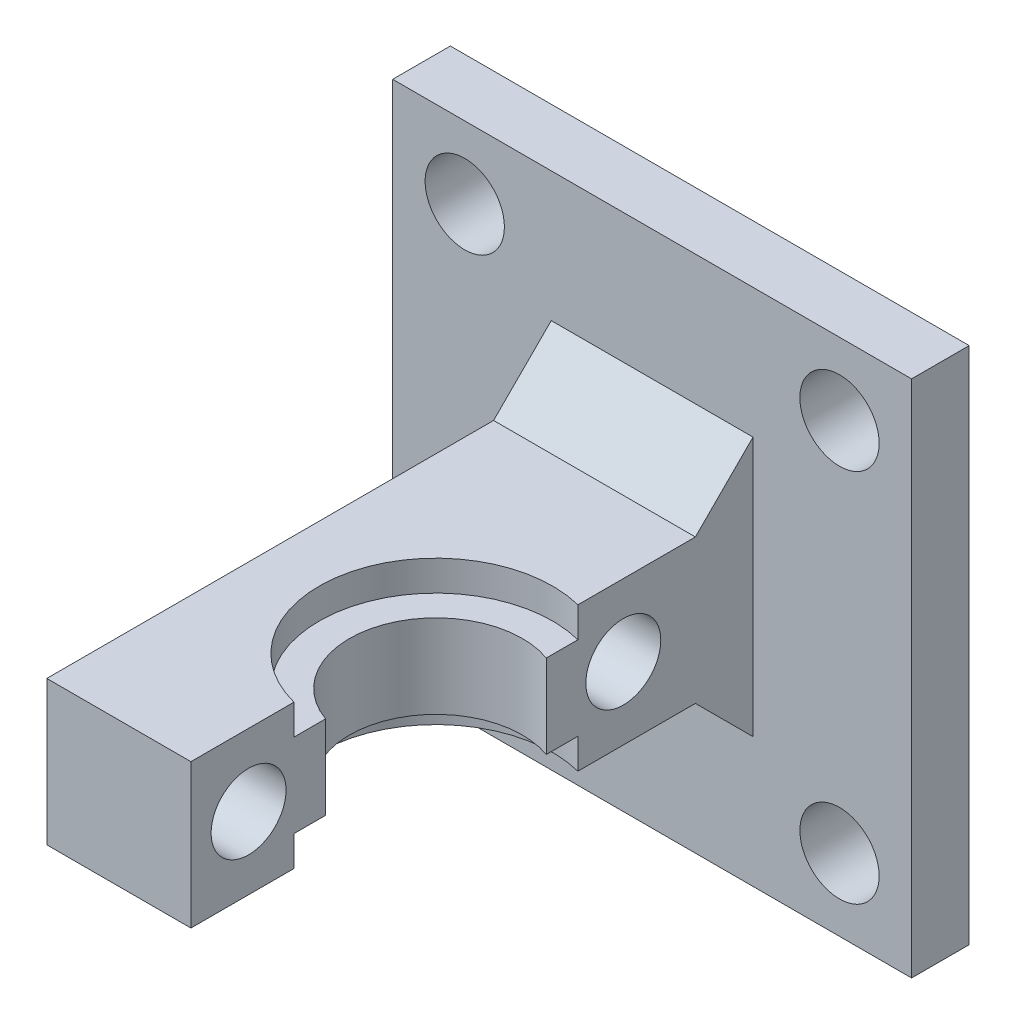
ISO-10303-21;
HEADER;
FILE_DESCRIPTION(('STEP AP214'),'2;1');
FILE_NAME('part.step','',(''),(''),'','','');
FILE_SCHEMA(('AUTOMOTIVE_DESIGN { 1 0 10303 214 1 1 1 1 }'));
ENDSEC;
DATA;
#1=APPLICATION_CONTEXT('core data for automotive mechanical design processes');
#2=APPLICATION_PROTOCOL_DEFINITION('international standard','automotive_design',2000,#1);
#3=PRODUCT_CONTEXT('',#1,'mechanical');
#4=PRODUCT('Part','Part','',(#3));
#5=PRODUCT_RELATED_PRODUCT_CATEGORY('part','',(#4));
#6=PRODUCT_DEFINITION_FORMATION('','',#4);
#7=PRODUCT_DEFINITION_CONTEXT('part definition',#1,'design');
#8=PRODUCT_DEFINITION('design','',#6,#7);
#9=PRODUCT_DEFINITION_SHAPE('','',#8);
#10=(LENGTH_UNIT() NAMED_UNIT(*) SI_UNIT(.MILLI.,.METRE.));
#11=(NAMED_UNIT(*) PLANE_ANGLE_UNIT() SI_UNIT($,.RADIAN.));
#12=(NAMED_UNIT(*) SI_UNIT($,.STERADIAN.) SOLID_ANGLE_UNIT());
#13=UNCERTAINTY_MEASURE_WITH_UNIT(LENGTH_MEASURE(1.E-05),#10,'distance_accuracy_value','');
#14=(GEOMETRIC_REPRESENTATION_CONTEXT(3) GLOBAL_UNCERTAINTY_ASSIGNED_CONTEXT((#13)) GLOBAL_UNIT_ASSIGNED_CONTEXT((#10,
#11,#12)) REPRESENTATION_CONTEXT('',''));
#15=CARTESIAN_POINT('',(0.,0.,0.));
#16=DIRECTION('',(0.,0.,1.));
#17=DIRECTION('',(1.,0.,0.));
#18=AXIS2_PLACEMENT_3D('',#15,#16,#17);
#19=CARTESIAN_POINT('',(5.,5.,24.));
#20=DIRECTION('',(0.,-1.,0.));
#21=DIRECTION('',(0.,0.,-1.));
#22=AXIS2_PLACEMENT_3D('',#19,#20,#21);
#23=CYLINDRICAL_SURFACE('',#22,8.1);
#24=CARTESIAN_POINT('',(5.,-2.9,24.));
#25=DIRECTION('',(0.,1.,0.));
#26=DIRECTION('',(0.,0.,1.));
#27=AXIS2_PLACEMENT_3D('',#24,#25,#26);
#28=CIRCLE('',#27,8.1);
#29=CARTESIAN_POINT('',(3.,-2.9,31.8492037812762));
#30=VERTEX_POINT('',#29);
#31=CARTESIAN_POINT('',(7.,-2.9,16.1507962187238));
#32=VERTEX_POINT('',#31);
#33=EDGE_CURVE('E52',#30,#32,#28,.F.);
#34=ORIENTED_EDGE('',*,*,#33,.F.);
#35=DIRECTION('',(0.,-1.,0.));
#36=VECTOR('',#35,1.);
#37=CARTESIAN_POINT('',(3.,5.,31.8492037812762));
#38=LINE('',#37,#36);
#39=CARTESIAN_POINT('',(3.,-5.,31.8492037812762));
#40=VERTEX_POINT('',#39);
#41=EDGE_CURVE('E226',#30,#40,#38,.T.);
#42=ORIENTED_EDGE('',*,*,#41,.T.);
#43=CARTESIAN_POINT('',(5.,-5.,24.));
#44=DIRECTION('',(0.,-1.,0.));
#45=DIRECTION('',(0.,0.,1.));
#46=AXIS2_PLACEMENT_3D('',#43,#44,#45);
#47=CIRCLE('',#46,8.1);
#48=CARTESIAN_POINT('',(7.,-5.,16.1507962187238));
#49=VERTEX_POINT('',#48);
#50=EDGE_CURVE('E216',#40,#49,#47,.T.);
#51=ORIENTED_EDGE('',*,*,#50,.T.);
#52=DIRECTION('',(0.,-1.,0.));
#53=VECTOR('',#52,1.);
#54=CARTESIAN_POINT('',(7.,5.,16.1507962187238));
#55=LINE('',#54,#53);
#56=EDGE_CURVE('E222',#32,#49,#55,.T.);
#57=ORIENTED_EDGE('',*,*,#56,.F.);
#58=EDGE_LOOP('',(#34,#42,#51,#57));
#59=FACE_BOUND('',#58,.T.);
#60=ADVANCED_FACE('F33',(#59),#23,.F.);
#61=CARTESIAN_POINT('',(-7.,0.,13.));
#62=DIRECTION('',(1.,0.,0.));
#63=DIRECTION('',(0.,0.,-1.));
#64=AXIS2_PLACEMENT_3D('',#61,#62,#63);
#65=CYLINDRICAL_SURFACE('',#64,2.6);
#66=CARTESIAN_POINT('',(-7.,0.,13.));
#67=DIRECTION('',(1.,0.,0.));
#68=DIRECTION('',(0.,0.,-1.));
#69=AXIS2_PLACEMENT_3D('',#66,#67,#68);
#70=CIRCLE('',#69,2.6);
#71=CARTESIAN_POINT('',(-7.,0.,10.4));
#72=VERTEX_POINT('',#71);
#73=EDGE_CURVE('E190',#72,#72,#70,.T.);
#74=ORIENTED_EDGE('',*,*,#73,.F.);
#75=EDGE_LOOP('',(#74));
#76=FACE_BOUND('',#75,.T.);
#77=CARTESIAN_POINT('',(7.,0.,13.));
#78=DIRECTION('',(1.,0.,0.));
#79=DIRECTION('',(0.,0.,-1.));
#80=AXIS2_PLACEMENT_3D('',#77,#78,#79);
#81=CIRCLE('',#80,2.6);
#82=CARTESIAN_POINT('',(7.,0.,10.4));
#83=VERTEX_POINT('',#82);
#84=EDGE_CURVE('E194',#83,#83,#81,.T.);
#85=ORIENTED_EDGE('',*,*,#84,.T.);
#86=EDGE_LOOP('',(#85));
#87=FACE_BOUND('',#86,.T.);
#88=CARTESIAN_POINT('',(3.70000000000004,0.,15.6));
#89=CARTESIAN_POINT('',(3.70000266711035,0.0246446385520677,15.5999994858206));
#90=CARTESIAN_POINT('',(3.70228665332227,0.0493029766518838,15.5996451391014));
#91=CARTESIAN_POINT('',(3.7111974815542,0.0978061832979912,15.5982735696307));
#92=CARTESIAN_POINT('',(3.71782939200899,0.121650068254081,15.5972555732615));
#93=CARTESIAN_POINT('',(3.73478093359689,0.167721413711001,15.5946866605523));
#94=CARTESIAN_POINT('',(3.74507166867469,0.18995994235702,15.5931399235997));
#95=CARTESIAN_POINT('',(3.76865895936663,0.23272295071679,15.5896526800661));
#96=CARTESIAN_POINT('',(3.78195654391533,0.253246840386271,15.5877120387155));
#97=CARTESIAN_POINT('',(3.82032584808766,0.305253555135389,15.5822245452235));
#98=CARTESIAN_POINT('',(3.84743823797105,0.335204653877232,15.5784526270009));
#99=CARTESIAN_POINT('',(3.90594045527389,0.390554954343029,15.5706514688819));
#100=CARTESIAN_POINT('',(3.93734337494103,0.415939650404897,15.566621462258));
#101=CARTESIAN_POINT('',(4.02515134468757,0.478472467646816,15.555907024401));
#102=CARTESIAN_POINT('',(4.08412697352073,0.511997711192338,15.5492666925414));
#103=CARTESIAN_POINT('',(4.20635063739925,0.570056355504465,15.5369066139386));
#104=CARTESIAN_POINT('',(4.26960732409404,0.594570862394637,15.5311888154973));
#105=CARTESIAN_POINT('',(4.44149399094251,0.65004419576083,15.5176895771876));
#106=CARTESIAN_POINT('',(4.55233408181402,0.674454695045524,15.5110628594));
#107=CARTESIAN_POINT('',(4.7766314996914,0.706608431328433,15.5021860240456));
#108=CARTESIAN_POINT('',(4.89009537969944,0.714304017630115,15.4999484206722));
#109=CARTESIAN_POINT('',(5.12229324478594,0.71396883979046,15.5000554958552));
#110=CARTESIAN_POINT('',(5.24103209177177,0.705206499796562,15.5026133283509));
#111=CARTESIAN_POINT('',(5.41652582320383,0.6781764213266,15.5100087137989));
#112=CARTESIAN_POINT('',(5.47449062289461,0.66688321653117,15.5130586724157));
#113=CARTESIAN_POINT('',(5.58910378443032,0.639198328721435,15.5202455099649));
#114=CARTESIAN_POINT('',(5.64575334433879,0.622811498438386,15.5243813537871));
#115=CARTESIAN_POINT('',(5.74857198642842,0.587138068771593,15.5328937628555));
#116=CARTESIAN_POINT('',(5.79503164697384,0.568663334269773,15.5371396087686));
#117=CARTESIAN_POINT('',(5.88579619989819,0.526820491825865,15.5461580607854));
#118=CARTESIAN_POINT('',(5.93009690279299,0.503443302846257,15.5509316365575));
#119=CARTESIAN_POINT('',(6.01574848190205,0.450613010832115,15.5607977001414));
#120=CARTESIAN_POINT('',(6.05705358677998,0.421084955973537,15.5658935240709));
#121=CARTESIAN_POINT('',(6.13369806208265,0.355066674843864,15.5758560511966));
#122=CARTESIAN_POINT('',(6.16906584958734,0.318611502706494,15.580723760424));
#123=CARTESIAN_POINT('',(6.21524615531826,0.257468421027484,15.5873048949636));
#124=CARTESIAN_POINT('',(6.22968243270645,0.235566068968109,15.5894085906244));
#125=CARTESIAN_POINT('',(6.25510879554287,0.189787058994486,15.5931655494481));
#126=CARTESIAN_POINT('',(6.26610121078474,0.165911749676084,15.5948191170257));
#127=CARTESIAN_POINT('',(6.28388688228515,0.116301470061408,15.5975171316654));
#128=CARTESIAN_POINT('',(6.29063612343278,0.0905500027884597,15.5985551878422));
#129=CARTESIAN_POINT('',(6.29904058249715,0.0382106245730077,15.5998504050423));
#130=CARTESIAN_POINT('',(6.30070104639114,0.0116236035892148,15.6001083702512));
#131=CARTESIAN_POINT('',(6.29887056882852,-0.0380731569205889,15.5998253253242));
#132=CARTESIAN_POINT('',(6.29598820081816,-0.0612083206831745,15.5993786975264));
#133=CARTESIAN_POINT('',(6.28643813542854,-0.106660739262427,15.5979109788073));
#134=CARTESIAN_POINT('',(6.27976842690653,-0.12897755281286,15.5968895826769));
#135=CARTESIAN_POINT('',(6.26101576181098,-0.177859143658967,15.594052748741));
#136=CARTESIAN_POINT('',(6.24798432530818,-0.204049582857031,15.592101002369));
#137=CARTESIAN_POINT('',(6.21789815965699,-0.253949305314392,15.5876902125312));
#138=CARTESIAN_POINT('',(6.20083612848259,-0.277653971341187,15.5852302493814));
#139=CARTESIAN_POINT('',(6.15453441868819,-0.333627827481036,15.5787277714951));
#140=CARTESIAN_POINT('',(6.12344521303143,-0.364335233239077,15.5745042451843));
#141=CARTESIAN_POINT('',(6.05698337493439,-0.420630820405962,15.5659070513656));
#142=CARTESIAN_POINT('',(6.02160064247138,-0.446206540238347,15.5615330478818));
#143=CARTESIAN_POINT('',(5.92213134412991,-0.509411670240929,15.5499336673464));
#144=CARTESIAN_POINT('',(5.85537805042234,-0.542846011862888,15.5428694577233));
#145=CARTESIAN_POINT('',(5.71768049284909,-0.599658985099565,15.5300667977269));
#146=CARTESIAN_POINT('',(5.64672803788713,-0.623017173688397,15.5243310534235));
#147=CARTESIAN_POINT('',(5.51670520338476,-0.657572868652399,15.5155208162479));
#148=CARTESIAN_POINT('',(5.45804161556919,-0.670258406185354,15.5121448070635));
#149=CARTESIAN_POINT('',(5.33980979546832,-0.690741344057659,15.5065880688304));
#150=CARTESIAN_POINT('',(5.28024110858591,-0.698536198876264,15.5044079623038));
#151=CARTESIAN_POINT('',(5.10044123600596,-0.715137062163548,15.499750618356));
#152=CARTESIAN_POINT('',(4.97942801978185,-0.717081836711884,15.4991779653655));
#153=CARTESIAN_POINT('',(4.79698794200043,-0.706407605688524,15.5021950705903));
#154=CARTESIAN_POINT('',(4.73504050665241,-0.700375530704898,15.5039061798466));
#155=CARTESIAN_POINT('',(4.61190487087694,-0.683228763101747,15.5086419900749));
#156=CARTESIAN_POINT('',(4.55071625158819,-0.672117015574107,15.5116659298432));
#157=CARTESIAN_POINT('',(4.43005436525828,-0.644413257281783,15.5189153544298));
#158=CARTESIAN_POINT('',(4.37057283403123,-0.627855540388093,15.5231332978862));
#159=CARTESIAN_POINT('',(4.25385495532783,-0.588470701840785,15.5326110043088));
#160=CARTESIAN_POINT('',(4.19661472162409,-0.565655036050854,15.5378688587451));
#161=CARTESIAN_POINT('',(4.10589247018947,-0.522180572291755,15.5470810797948));
#162=CARTESIAN_POINT('',(4.07132543186498,-0.503742575664736,15.5508162531238));
#163=CARTESIAN_POINT('',(4.00423513743781,-0.463362068038479,15.5584604683142));
#164=CARTESIAN_POINT('',(3.97171401903171,-0.441415973623528,15.5623696849777));
#165=CARTESIAN_POINT('',(3.90939509969128,-0.393304192473495,15.5701971519027));
#166=CARTESIAN_POINT('',(3.87962686596363,-0.367099537587357,15.5741151201549));
#167=CARTESIAN_POINT('',(3.82473921050896,-0.310131578920839,15.5815960872351));
#168=CARTESIAN_POINT('',(3.79960800705441,-0.279380196204407,15.5851599747578));
#169=CARTESIAN_POINT('',(3.76413655062274,-0.225227087124255,15.5903127405192));
#170=CARTESIAN_POINT('',(3.75173702375318,-0.203202245365268,15.5921492339267));
#171=CARTESIAN_POINT('',(3.73051096100129,-0.157465050800809,15.5953279095812));
#172=CARTESIAN_POINT('',(3.72167775420576,-0.133755947113204,15.5966710142987));
#173=CARTESIAN_POINT('',(3.7100767482343,-0.0916532261959274,15.5984452222065));
#174=CARTESIAN_POINT('',(3.70631804463677,-0.0735368951870844,15.5990242474313));
#175=CARTESIAN_POINT('',(3.70127857406311,-0.036949628459925,15.5998018439192));
#176=CARTESIAN_POINT('',(3.69999800018826,-0.0184786652211387,15.6000003855341));
#177=CARTESIAN_POINT('',(3.70000000000004,0.,15.6));
#178=B_SPLINE_CURVE_WITH_KNOTS('',3,(#88,#89,#90,#91,#92,#93,#94,#95,#96,#97,#98,#99,#100,#101,
#102,#103,#104,#105,#106,#107,#108,#109,#110,#111,#112,#113,#114,#115,#116,#117,#118,#119,#120,
#121,#122,#123,#124,#125,#126,#127,#128,#129,#130,#131,#132,#133,#134,#135,#136,#137,#138,#139,
#140,#141,#142,#143,#144,#145,#146,#147,#148,#149,#150,#151,#152,#153,#154,#155,#156,#157,#158,
#159,#160,#161,#162,#163,#164,#165,#166,#167,#168,#169,#170,#171,#172,#173,#174,#175,#176,#177),
.UNSPECIFIED.,.T.,.F.,(4,2,2,2,2,2,2,2,2,2,2,2,2,2,2,2,2,2,2,2,2,2,2,2,2,2,2,2,2,2,2,2,2,2,2,2,
2,2,2,2,2,2,2,2,4),(0.,0.0738559209400195,0.147798090186888,0.221168809397196,0.294564673938246,
0.415591611305624,0.5369964639744,0.740334957731089,0.944097415419544,1.28330637190744,
1.62348107937878,1.97913570584439,2.15635512205151,2.33340621495194,2.48371439072381,
2.63430348804519,2.78684792182428,2.9386400391484,3.01734655899313,3.09599971784728,
3.17545585083391,3.25483004556811,3.32444001364924,3.39408698043023,3.48155640916668,
3.5691855338482,3.70014981419978,3.83142837309955,4.05515514549684,4.27933371570412,
4.45943339526073,4.63962673617629,5.00096902586841,5.1876029674382,5.37412883937237,
5.55950193294432,5.74453791981373,5.86243992775728,5.98046314780498,6.09963439825919,
6.2184985595714,6.2942727831185,6.36990460452187,6.42527780475544,6.48065531961597),.UNSPECIFIED.);
#179=CARTESIAN_POINT('',(3.70000000000004,0.,15.6));
#180=VERTEX_POINT('',#179);
#181=EDGE_CURVE('E11',#180,#180,#178,.T.);
#182=ORIENTED_EDGE('',*,*,#181,.F.);
#183=EDGE_LOOP('',(#182));
#184=FACE_BOUND('',#183,.T.);
#185=ADVANCED_FACE('F326',(#76,#87,#184),#65,.F.);
#186=CARTESIAN_POINT('',(18.,18.,4.));
#187=DIRECTION('',(-1.,0.,0.));
#188=DIRECTION('',(0.,-1.,0.));
#189=AXIS2_PLACEMENT_3D('',#186,#187,#188);
#190=PLANE('',#189);
#191=DIRECTION('',(0.,1.,0.));
#192=VECTOR('',#191,1.);
#193=CARTESIAN_POINT('',(18.,18.,0.));
#194=LINE('',#193,#192);
#195=CARTESIAN_POINT('',(18.,-18.,0.));
#196=VERTEX_POINT('',#195);
#197=CARTESIAN_POINT('',(18.,18.,0.));
#198=VERTEX_POINT('',#197);
#199=EDGE_CURVE('E260',#196,#198,#194,.T.);
#200=ORIENTED_EDGE('',*,*,#199,.T.);
#201=DIRECTION('',(0.,0.,-1.));
#202=VECTOR('',#201,1.);
#203=CARTESIAN_POINT('',(18.,18.,4.));
#204=LINE('',#203,#202);
#205=CARTESIAN_POINT('',(18.,18.,4.));
#206=VERTEX_POINT('',#205);
#207=EDGE_CURVE('E287',#206,#198,#204,.T.);
#208=ORIENTED_EDGE('',*,*,#207,.F.);
#209=DIRECTION('',(0.,1.,0.));
#210=VECTOR('',#209,1.);
#211=CARTESIAN_POINT('',(18.,18.,4.));
#212=LINE('',#211,#210);
#213=CARTESIAN_POINT('',(18.,-18.,4.));
#214=VERTEX_POINT('',#213);
#215=EDGE_CURVE('E261',#214,#206,#212,.T.);
#216=ORIENTED_EDGE('',*,*,#215,.F.);
#217=DIRECTION('',(0.,0.,-1.));
#218=VECTOR('',#217,1.);
#219=CARTESIAN_POINT('',(18.,-18.,4.));
#220=LINE('',#219,#218);
#221=EDGE_CURVE('E271',#214,#196,#220,.T.);
#222=ORIENTED_EDGE('',*,*,#221,.T.);
#223=EDGE_LOOP('',(#200,#208,#216,#222));
#224=FACE_BOUND('',#223,.T.);
#225=ADVANCED_FACE('F332',(#224),#190,.F.);
#226=CARTESIAN_POINT('',(-18.,18.,4.));
#227=DIRECTION('',(0.,-1.,0.));
#228=DIRECTION('',(0.,0.,-1.));
#229=AXIS2_PLACEMENT_3D('',#226,#227,#228);
#230=PLANE('',#229);
#231=DIRECTION('',(-1.,0.,0.));
#232=VECTOR('',#231,1.);
#233=CARTESIAN_POINT('',(-18.,18.,0.));
#234=LINE('',#233,#232);
#235=CARTESIAN_POINT('',(-18.,18.,0.));
#236=VERTEX_POINT('',#235);
#237=EDGE_CURVE('E274',#198,#236,#234,.T.);
#238=ORIENTED_EDGE('',*,*,#237,.T.);
#239=DIRECTION('',(0.,0.,-1.));
#240=VECTOR('',#239,1.);
#241=CARTESIAN_POINT('',(-18.,18.,4.));
#242=LINE('',#241,#240);
#243=CARTESIAN_POINT('',(-18.,18.,4.));
#244=VERTEX_POINT('',#243);
#245=EDGE_CURVE('E284',#244,#236,#242,.T.);
#246=ORIENTED_EDGE('',*,*,#245,.F.);
#247=DIRECTION('',(-1.,0.,0.));
#248=VECTOR('',#247,1.);
#249=CARTESIAN_POINT('',(-18.,18.,4.));
#250=LINE('',#249,#248);
#251=EDGE_CURVE('E264',#206,#244,#250,.T.);
#252=ORIENTED_EDGE('',*,*,#251,.F.);
#253=ORIENTED_EDGE('',*,*,#207,.T.);
#254=EDGE_LOOP('',(#238,#246,#252,#253));
#255=FACE_BOUND('',#254,.T.);
#256=ADVANCED_FACE('F386',(#255),#230,.F.);
#257=CARTESIAN_POINT('',(-18.,18.,4.));
#258=DIRECTION('',(1.,0.,0.));
#259=DIRECTION('',(0.,0.,-1.));
#260=AXIS2_PLACEMENT_3D('',#257,#258,#259);
#261=PLANE('',#260);
#262=DIRECTION('',(0.,-1.,0.));
#263=VECTOR('',#262,1.);
#264=CARTESIAN_POINT('',(-18.,18.,0.));
#265=LINE('',#264,#263);
#266=CARTESIAN_POINT('',(-18.,-18.,0.));
#267=VERTEX_POINT('',#266);
#268=EDGE_CURVE('E276',#236,#267,#265,.T.);
#269=ORIENTED_EDGE('',*,*,#268,.T.);
#270=DIRECTION('',(0.,0.,-1.));
#271=VECTOR('',#270,1.);
#272=CARTESIAN_POINT('',(-18.,-18.,4.));
#273=LINE('',#272,#271);
#274=CARTESIAN_POINT('',(-18.,-18.,4.));
#275=VERTEX_POINT('',#274);
#276=EDGE_CURVE('E281',#275,#267,#273,.T.);
#277=ORIENTED_EDGE('',*,*,#276,.F.);
#278=DIRECTION('',(0.,-1.,0.));
#279=VECTOR('',#278,1.);
#280=CARTESIAN_POINT('',(-18.,18.,4.));
#281=LINE('',#280,#279);
#282=EDGE_CURVE('E267',#244,#275,#281,.T.);
#283=ORIENTED_EDGE('',*,*,#282,.F.);
#284=ORIENTED_EDGE('',*,*,#245,.T.);
#285=EDGE_LOOP('',(#269,#277,#283,#284));
#286=FACE_BOUND('',#285,.T.);
#287=ADVANCED_FACE('F382',(#286),#261,.F.);
#288=CARTESIAN_POINT('',(-18.,-18.,4.));
#289=DIRECTION('',(0.,1.,0.));
#290=DIRECTION('',(0.,0.,1.));
#291=AXIS2_PLACEMENT_3D('',#288,#289,#290);
#292=PLANE('',#291);
#293=DIRECTION('',(1.,0.,0.));
#294=VECTOR('',#293,1.);
#295=CARTESIAN_POINT('',(-18.,-18.,0.));
#296=LINE('',#295,#294);
#297=EDGE_CURVE('E265',#267,#196,#296,.T.);
#298=ORIENTED_EDGE('',*,*,#297,.T.);
#299=ORIENTED_EDGE('',*,*,#221,.F.);
#300=DIRECTION('',(1.,0.,0.));
#301=VECTOR('',#300,1.);
#302=CARTESIAN_POINT('',(-18.,-18.,4.));
#303=LINE('',#302,#301);
#304=EDGE_CURVE('E269',#275,#214,#303,.T.);
#305=ORIENTED_EDGE('',*,*,#304,.F.);
#306=ORIENTED_EDGE('',*,*,#276,.T.);
#307=EDGE_LOOP('',(#298,#299,#305,#306));
#308=FACE_BOUND('',#307,.T.);
#309=ADVANCED_FACE('F375',(#308),#292,.F.);
#310=CARTESIAN_POINT('',(0.,0.,4.));
#311=DIRECTION('',(0.,0.,1.));
#312=DIRECTION('',(1.,0.,0.));
#313=AXIS2_PLACEMENT_3D('',#310,#311,#312);
#314=PLANE('',#313);
#315=DIRECTION('',(-1.,0.,0.));
#316=VECTOR('',#315,1.);
#317=CARTESIAN_POINT('',(0.,-9.00000000000002,4.));
#318=LINE('',#317,#316);
#319=CARTESIAN_POINT('',(7.,-9.00000000000002,4.));
#320=VERTEX_POINT('',#319);
#321=CARTESIAN_POINT('',(-7.,-9.00000000000002,4.));
#322=VERTEX_POINT('',#321);
#323=EDGE_CURVE('E293',#320,#322,#318,.T.);
#324=ORIENTED_EDGE('',*,*,#323,.T.);
#325=DIRECTION('',(0.,-1.,0.));
#326=VECTOR('',#325,1.);
#327=CARTESIAN_POINT('',(-7.,5.,4.));
#328=LINE('',#327,#326);
#329=CARTESIAN_POINT('',(-7.,8.99999999999998,4.));
#330=VERTEX_POINT('',#329);
#331=EDGE_CURVE('E234',#330,#322,#328,.T.);
#332=ORIENTED_EDGE('',*,*,#331,.F.);
#333=DIRECTION('',(1.,0.,0.));
#334=VECTOR('',#333,1.);
#335=CARTESIAN_POINT('',(7.,8.99999999999998,4.));
#336=LINE('',#335,#334);
#337=CARTESIAN_POINT('',(7.,8.99999999999998,4.));
#338=VERTEX_POINT('',#337);
#339=EDGE_CURVE('E290',#330,#338,#336,.T.);
#340=ORIENTED_EDGE('',*,*,#339,.T.);
#341=DIRECTION('',(0.,-1.,0.));
#342=VECTOR('',#341,1.);
#343=CARTESIAN_POINT('',(7.,5.,4.));
#344=LINE('',#343,#342);
#345=EDGE_CURVE('E209',#338,#320,#344,.T.);
#346=ORIENTED_EDGE('',*,*,#345,.T.);
#347=EDGE_LOOP('',(#324,#332,#340,#346));
#348=FACE_BOUND('',#347,.T.);
#349=CARTESIAN_POINT('',(-13.,-13.,4.));
#350=DIRECTION('',(0.,0.,1.));
#351=DIRECTION('',(1.,0.,0.));
#352=AXIS2_PLACEMENT_3D('',#349,#350,#351);
#353=CIRCLE('',#352,2.75);
#354=CARTESIAN_POINT('',(-10.25,-13.,4.));
#355=VERTEX_POINT('',#354);
#356=EDGE_CURVE('E239',#355,#355,#353,.T.);
#357=ORIENTED_EDGE('',*,*,#356,.F.);
#358=EDGE_LOOP('',(#357));
#359=FACE_BOUND('',#358,.T.);
#360=CARTESIAN_POINT('',(13.,-13.,4.));
#361=DIRECTION('',(0.,0.,1.));
#362=DIRECTION('',(1.,0.,0.));
#363=AXIS2_PLACEMENT_3D('',#360,#361,#362);
#364=CIRCLE('',#363,2.75);
#365=CARTESIAN_POINT('',(15.75,-13.,4.));
#366=VERTEX_POINT('',#365);
#367=EDGE_CURVE('E245',#366,#366,#364,.T.);
#368=ORIENTED_EDGE('',*,*,#367,.F.);
#369=EDGE_LOOP('',(#368));
#370=FACE_BOUND('',#369,.T.);
#371=CARTESIAN_POINT('',(13.,13.,4.));
#372=DIRECTION('',(0.,0.,1.));
#373=DIRECTION('',(1.,0.,0.));
#374=AXIS2_PLACEMENT_3D('',#371,#372,#373);
#375=CIRCLE('',#374,2.75);
#376=CARTESIAN_POINT('',(15.75,13.,4.));
#377=VERTEX_POINT('',#376);
#378=EDGE_CURVE('E251',#377,#377,#375,.T.);
#379=ORIENTED_EDGE('',*,*,#378,.F.);
#380=EDGE_LOOP('',(#379));
#381=FACE_BOUND('',#380,.T.);
#382=CARTESIAN_POINT('',(-13.,13.,4.));
#383=DIRECTION('',(0.,0.,1.));
#384=DIRECTION('',(1.,0.,0.));
#385=AXIS2_PLACEMENT_3D('',#382,#383,#384);
#386=CIRCLE('',#385,2.75);
#387=CARTESIAN_POINT('',(-10.25,13.,4.));
#388=VERTEX_POINT('',#387);
#389=EDGE_CURVE('E257',#388,#388,#386,.T.);
#390=ORIENTED_EDGE('',*,*,#389,.F.);
#391=EDGE_LOOP('',(#390));
#392=FACE_BOUND('',#391,.T.);
#393=ORIENTED_EDGE('',*,*,#215,.T.);
#394=ORIENTED_EDGE('',*,*,#251,.T.);
#395=ORIENTED_EDGE('',*,*,#282,.T.);
#396=ORIENTED_EDGE('',*,*,#304,.T.);
#397=EDGE_LOOP('',(#393,#394,#395,#396));
#398=FACE_BOUND('',#397,.T.);
#399=ADVANCED_FACE('F372',(#348,#359,#370,#381,#392,#398),#314,.T.);
#400=CARTESIAN_POINT('',(0.,0.,0.));
#401=DIRECTION('',(0.,0.,1.));
#402=DIRECTION('',(1.,0.,0.));
#403=AXIS2_PLACEMENT_3D('',#400,#401,#402);
#404=PLANE('',#403);
#405=CARTESIAN_POINT('',(-13.,-13.,0.));
#406=DIRECTION('',(0.,0.,1.));
#407=DIRECTION('',(-1.,0.,0.));
#408=AXIS2_PLACEMENT_3D('',#405,#406,#407);
#409=CIRCLE('',#408,2.75);
#410=CARTESIAN_POINT('',(-15.75,-13.,0.));
#411=VERTEX_POINT('',#410);
#412=EDGE_CURVE('E236',#411,#411,#409,.T.);
#413=ORIENTED_EDGE('',*,*,#412,.T.);
#414=EDGE_LOOP('',(#413));
#415=FACE_BOUND('',#414,.T.);
#416=CARTESIAN_POINT('',(13.,-13.,0.));
#417=DIRECTION('',(0.,0.,1.));
#418=DIRECTION('',(1.,0.,0.));
#419=AXIS2_PLACEMENT_3D('',#416,#417,#418);
#420=CIRCLE('',#419,2.75);
#421=CARTESIAN_POINT('',(15.75,-13.,0.));
#422=VERTEX_POINT('',#421);
#423=EDGE_CURVE('E242',#422,#422,#420,.T.);
#424=ORIENTED_EDGE('',*,*,#423,.T.);
#425=EDGE_LOOP('',(#424));
#426=FACE_BOUND('',#425,.T.);
#427=CARTESIAN_POINT('',(13.,13.,0.));
#428=DIRECTION('',(0.,0.,1.));
#429=DIRECTION('',(-1.,0.,0.));
#430=AXIS2_PLACEMENT_3D('',#427,#428,#429);
#431=CIRCLE('',#430,2.75);
#432=CARTESIAN_POINT('',(10.25,13.,0.));
#433=VERTEX_POINT('',#432);
#434=EDGE_CURVE('E248',#433,#433,#431,.T.);
#435=ORIENTED_EDGE('',*,*,#434,.T.);
#436=EDGE_LOOP('',(#435));
#437=FACE_BOUND('',#436,.T.);
#438=CARTESIAN_POINT('',(-13.,13.,0.));
#439=DIRECTION('',(0.,0.,1.));
#440=DIRECTION('',(1.,0.,0.));
#441=AXIS2_PLACEMENT_3D('',#438,#439,#440);
#442=CIRCLE('',#441,2.75);
#443=CARTESIAN_POINT('',(-10.25,13.,0.));
#444=VERTEX_POINT('',#443);
#445=EDGE_CURVE('E254',#444,#444,#442,.T.);
#446=ORIENTED_EDGE('',*,*,#445,.T.);
#447=EDGE_LOOP('',(#446));
#448=FACE_BOUND('',#447,.T.);
#449=ORIENTED_EDGE('',*,*,#199,.F.);
#450=ORIENTED_EDGE('',*,*,#297,.F.);
#451=ORIENTED_EDGE('',*,*,#268,.F.);
#452=ORIENTED_EDGE('',*,*,#237,.F.);
#453=EDGE_LOOP('',(#449,#450,#451,#452));
#454=FACE_BOUND('',#453,.T.);
#455=ADVANCED_FACE('F370',(#415,#426,#437,#448,#454),#404,.F.);
#456=CARTESIAN_POINT('',(-13.,13.,4.001));
#457=DIRECTION('',(0.,0.,-1.));
#458=DIRECTION('',(-1.,0.,0.));
#459=AXIS2_PLACEMENT_3D('',#456,#457,#458);
#460=CYLINDRICAL_SURFACE('',#459,2.75);
#461=ORIENTED_EDGE('',*,*,#389,.T.);
#462=EDGE_LOOP('',(#461));
#463=FACE_BOUND('',#462,.T.);
#464=ORIENTED_EDGE('',*,*,#445,.F.);
#465=EDGE_LOOP('',(#464));
#466=FACE_BOUND('',#465,.T.);
#467=ADVANCED_FACE('F366',(#463,#466),#460,.F.);
#468=CARTESIAN_POINT('',(13.,13.,4.001));
#469=DIRECTION('',(0.,0.,-1.));
#470=DIRECTION('',(-1.,0.,0.));
#471=AXIS2_PLACEMENT_3D('',#468,#469,#470);
#472=CYLINDRICAL_SURFACE('',#471,2.75);
#473=ORIENTED_EDGE('',*,*,#378,.T.);
#474=EDGE_LOOP('',(#473));
#475=FACE_BOUND('',#474,.T.);
#476=ORIENTED_EDGE('',*,*,#434,.F.);
#477=EDGE_LOOP('',(#476));
#478=FACE_BOUND('',#477,.T.);
#479=ADVANCED_FACE('F362',(#475,#478),#472,.F.);
#480=CARTESIAN_POINT('',(13.,-13.,4.001));
#481=DIRECTION('',(0.,0.,-1.));
#482=DIRECTION('',(-1.,0.,0.));
#483=AXIS2_PLACEMENT_3D('',#480,#481,#482);
#484=CYLINDRICAL_SURFACE('',#483,2.75);
#485=ORIENTED_EDGE('',*,*,#367,.T.);
#486=EDGE_LOOP('',(#485));
#487=FACE_BOUND('',#486,.T.);
#488=ORIENTED_EDGE('',*,*,#423,.F.);
#489=EDGE_LOOP('',(#488));
#490=FACE_BOUND('',#489,.T.);
#491=ADVANCED_FACE('F358',(#487,#490),#484,.F.);
#492=CARTESIAN_POINT('',(-13.,-13.,4.001));
#493=DIRECTION('',(0.,0.,-1.));
#494=DIRECTION('',(-1.,0.,0.));
#495=AXIS2_PLACEMENT_3D('',#492,#493,#494);
#496=CYLINDRICAL_SURFACE('',#495,2.75);
#497=ORIENTED_EDGE('',*,*,#356,.T.);
#498=EDGE_LOOP('',(#497));
#499=FACE_BOUND('',#498,.T.);
#500=ORIENTED_EDGE('',*,*,#412,.F.);
#501=EDGE_LOOP('',(#500));
#502=FACE_BOUND('',#501,.T.);
#503=ADVANCED_FACE('F354',(#499,#502),#496,.F.);
#504=CARTESIAN_POINT('',(-7.,5.,4.));
#505=DIRECTION('',(1.,0.,0.));
#506=DIRECTION('',(0.,0.,-1.));
#507=AXIS2_PLACEMENT_3D('',#504,#505,#506);
#508=PLANE('',#507);
#509=CARTESIAN_POINT('',(-7.,0.,35.));
#510=DIRECTION('',(1.,0.,0.));
#511=DIRECTION('',(0.,0.,-1.));
#512=AXIS2_PLACEMENT_3D('',#509,#510,#511);
#513=CIRCLE('',#512,2.6);
#514=CARTESIAN_POINT('',(-7.,0.,32.4));
#515=VERTEX_POINT('',#514);
#516=EDGE_CURVE('E186',#515,#515,#513,.T.);
#517=ORIENTED_EDGE('',*,*,#516,.T.);
#518=EDGE_LOOP('',(#517));
#519=FACE_BOUND('',#518,.T.);
#520=ORIENTED_EDGE('',*,*,#73,.T.);
#521=EDGE_LOOP('',(#520));
#522=FACE_BOUND('',#521,.T.);
#523=ORIENTED_EDGE('',*,*,#331,.T.);
#524=DIRECTION('',(0.,0.707106781186551,0.707106781186544));
#525=VECTOR('',#524,1.);
#526=CARTESIAN_POINT('',(-7.,-1.99999999999993,11.));
#527=LINE('',#526,#525);
#528=CARTESIAN_POINT('',(-7.,-5.,7.99999999999998));
#529=VERTEX_POINT('',#528);
#530=EDGE_CURVE('E301',#322,#529,#527,.T.);
#531=ORIENTED_EDGE('',*,*,#530,.T.);
#532=DIRECTION('',(0.,0.,1.));
#533=VECTOR('',#532,1.);
#534=CARTESIAN_POINT('',(-7.,-5.,4.));
#535=LINE('',#534,#533);
#536=CARTESIAN_POINT('',(-7.,-5.,39.));
#537=VERTEX_POINT('',#536);
#538=EDGE_CURVE('E193',#529,#537,#535,.T.);
#539=ORIENTED_EDGE('',*,*,#538,.T.);
#540=DIRECTION('',(0.,-1.,0.));
#541=VECTOR('',#540,1.);
#542=CARTESIAN_POINT('',(-7.,5.,39.));
#543=LINE('',#542,#541);
#544=CARTESIAN_POINT('',(-7.,5.,39.));
#545=VERTEX_POINT('',#544);
#546=EDGE_CURVE('E231',#545,#537,#543,.T.);
#547=ORIENTED_EDGE('',*,*,#546,.F.);
#548=DIRECTION('',(0.,0.,1.));
#549=VECTOR('',#548,1.);
#550=CARTESIAN_POINT('',(-7.,5.,4.));
#551=LINE('',#550,#549);
#552=CARTESIAN_POINT('',(-7.,5.,8.00000000000003));
#553=VERTEX_POINT('',#552);
#554=EDGE_CURVE('E197',#553,#545,#551,.T.);
#555=ORIENTED_EDGE('',*,*,#554,.F.);
#556=DIRECTION('',(0.,-0.707106781186543,0.707106781186552));
#557=VECTOR('',#556,1.);
#558=CARTESIAN_POINT('',(-7.,7.00000000000002,5.99999999999999));
#559=LINE('',#558,#557);
#560=EDGE_CURVE('E306',#553,#330,#559,.F.);
#561=ORIENTED_EDGE('',*,*,#560,.T.);
#562=EDGE_LOOP('',(#523,#531,#539,#547,#555,#561));
#563=FACE_BOUND('',#562,.T.);
#564=ADVANCED_FACE('F348',(#519,#522,#563),#508,.F.);
#565=CARTESIAN_POINT('',(-7.,5.,39.));
#566=DIRECTION('',(0.,0.,-1.));
#567=DIRECTION('',(-1.,0.,0.));
#568=AXIS2_PLACEMENT_3D('',#565,#566,#567);
#569=PLANE('',#568);
#570=DIRECTION('',(1.,0.,0.));
#571=VECTOR('',#570,1.);
#572=CARTESIAN_POINT('',(-7.,-5.,39.));
#573=LINE('',#572,#571);
#574=CARTESIAN_POINT('',(3.,-5.,39.));
#575=VERTEX_POINT('',#574);
#576=EDGE_CURVE('E211',#537,#575,#573,.T.);
#577=ORIENTED_EDGE('',*,*,#576,.T.);
#578=DIRECTION('',(0.,-1.,0.));
#579=VECTOR('',#578,1.);
#580=CARTESIAN_POINT('',(3.,5.,39.));
#581=LINE('',#580,#579);
#582=CARTESIAN_POINT('',(3.,5.,39.));
#583=VERTEX_POINT('',#582);
#584=EDGE_CURVE('E228',#583,#575,#581,.T.);
#585=ORIENTED_EDGE('',*,*,#584,.F.);
#586=DIRECTION('',(1.,0.,0.));
#587=VECTOR('',#586,1.);
#588=CARTESIAN_POINT('',(-7.,5.,39.));
#589=LINE('',#588,#587);
#590=EDGE_CURVE('E199',#545,#583,#589,.T.);
#591=ORIENTED_EDGE('',*,*,#590,.F.);
#592=ORIENTED_EDGE('',*,*,#546,.T.);
#593=EDGE_LOOP('',(#577,#585,#591,#592));
#594=FACE_BOUND('',#593,.T.);
#595=ADVANCED_FACE('F344',(#594),#569,.F.);
#596=CARTESIAN_POINT('',(3.,5.,39.));
#597=DIRECTION('',(-1.,0.,0.));
#598=DIRECTION('',(0.,0.,1.));
#599=AXIS2_PLACEMENT_3D('',#596,#597,#598);
#600=PLANE('',#599);
#601=DIRECTION('',(0.,0.,-1.));
#602=VECTOR('',#601,1.);
#603=CARTESIAN_POINT('',(3.,2.9,29.6568542494924));
#604=LINE('',#603,#602);
#605=CARTESIAN_POINT('',(3.,2.9,31.8492037812762));
#606=VERTEX_POINT('',#605);
#607=CARTESIAN_POINT('',(3.,2.9,29.6568542494924));
#608=VERTEX_POINT('',#607);
#609=EDGE_CURVE('E150',#606,#608,#604,.T.);
#610=ORIENTED_EDGE('',*,*,#609,.F.);
#611=CARTESIAN_POINT('',(3.,5.,31.8492037812762));
#612=VERTEX_POINT('',#611);
#613=EDGE_CURVE('E60',#612,#606,#38,.T.);
#614=ORIENTED_EDGE('',*,*,#613,.F.);
#615=DIRECTION('',(0.,0.,-1.));
#616=VECTOR('',#615,1.);
#617=CARTESIAN_POINT('',(3.,5.,39.));
#618=LINE('',#617,#616);
#619=EDGE_CURVE('E202',#583,#612,#618,.T.);
#620=ORIENTED_EDGE('',*,*,#619,.F.);
#621=ORIENTED_EDGE('',*,*,#584,.T.);
#622=DIRECTION('',(0.,0.,-1.));
#623=VECTOR('',#622,1.);
#624=CARTESIAN_POINT('',(3.,-5.,39.));
#625=LINE('',#624,#623);
#626=EDGE_CURVE('E213',#575,#40,#625,.T.);
#627=ORIENTED_EDGE('',*,*,#626,.T.);
#628=ORIENTED_EDGE('',*,*,#41,.F.);
#629=DIRECTION('',(0.,0.,-1.));
#630=VECTOR('',#629,1.);
#631=CARTESIAN_POINT('',(3.,-2.9,29.6568542494924));
#632=LINE('',#631,#630);
#633=CARTESIAN_POINT('',(3.,-2.9,29.6568542494924));
#634=VERTEX_POINT('',#633);
#635=EDGE_CURVE('E166',#30,#634,#632,.T.);
#636=ORIENTED_EDGE('',*,*,#635,.T.);
#637=DIRECTION('',(0.,-1.,0.));
#638=VECTOR('',#637,1.);
#639=CARTESIAN_POINT('',(3.,2.9,29.6568542494924));
#640=LINE('',#639,#638);
#641=EDGE_CURVE('E162',#608,#634,#640,.T.);
#642=ORIENTED_EDGE('',*,*,#641,.F.);
#643=EDGE_LOOP('',(#610,#614,#620,#621,#627,#628,#636,#642));
#644=FACE_BOUND('',#643,.T.);
#645=CARTESIAN_POINT('',(3.00000000000001,0.,35.));
#646=DIRECTION('',(-1.,0.,0.));
#647=DIRECTION('',(0.,0.,1.));
#648=AXIS2_PLACEMENT_3D('',#645,#646,#647);
#649=CIRCLE('',#648,2.6);
#650=CARTESIAN_POINT('',(3.00000000000001,0.,37.6));
#651=VERTEX_POINT('',#650);
#652=EDGE_CURVE('E189',#651,#651,#649,.T.);
#653=ORIENTED_EDGE('',*,*,#652,.T.);
#654=EDGE_LOOP('',(#653));
#655=FACE_BOUND('',#654,.T.);
#656=ADVANCED_FACE('F163',(#644,#655),#600,.F.);
#657=ORIENTED_EDGE('',*,*,#613,.T.);
#658=CARTESIAN_POINT('',(5.,2.9,24.));
#659=DIRECTION('',(0.,1.,0.));
#660=DIRECTION('',(0.,0.,1.));
#661=AXIS2_PLACEMENT_3D('',#658,#659,#660);
#662=CIRCLE('',#661,8.1);
#663=CARTESIAN_POINT('',(7.,2.9,16.1507962187238));
#664=VERTEX_POINT('',#663);
#665=EDGE_CURVE('E157',#606,#664,#662,.F.);
#666=ORIENTED_EDGE('',*,*,#665,.T.);
#667=CARTESIAN_POINT('',(7.,5.,16.1507962187238));
#668=VERTEX_POINT('',#667);
#669=EDGE_CURVE('E223',#668,#664,#55,.T.);
#670=ORIENTED_EDGE('',*,*,#669,.F.);
#671=CARTESIAN_POINT('',(5.,5.,24.));
#672=DIRECTION('',(0.,-1.,0.));
#673=DIRECTION('',(0.,0.,1.));
#674=AXIS2_PLACEMENT_3D('',#671,#672,#673);
#675=CIRCLE('',#674,8.1);
#676=EDGE_CURVE('E204',#612,#668,#675,.T.);
#677=ORIENTED_EDGE('',*,*,#676,.F.);
#678=EDGE_LOOP('',(#657,#666,#670,#677));
#679=FACE_BOUND('',#678,.T.);
#680=ADVANCED_FACE('F328',(#679),#23,.F.);
#681=CARTESIAN_POINT('',(7.,5.,16.1507962187238));
#682=DIRECTION('',(-1.,0.,0.));
#683=DIRECTION('',(0.,0.,1.));
#684=AXIS2_PLACEMENT_3D('',#681,#682,#683);
#685=PLANE('',#684);
#686=ORIENTED_EDGE('',*,*,#84,.F.);
#687=EDGE_LOOP('',(#686));
#688=FACE_BOUND('',#687,.T.);
#689=ORIENTED_EDGE('',*,*,#669,.T.);
#690=DIRECTION('',(0.,0.,-1.));
#691=VECTOR('',#690,1.);
#692=CARTESIAN_POINT('',(7.,2.9,15.7386441790709));
#693=LINE('',#692,#691);
#694=CARTESIAN_POINT('',(7.,2.9,18.3431457505076));
#695=VERTEX_POINT('',#694);
#696=EDGE_CURVE('E174',#695,#664,#693,.T.);
#697=ORIENTED_EDGE('',*,*,#696,.F.);
#698=DIRECTION('',(0.,-1.,0.));
#699=VECTOR('',#698,1.);
#700=CARTESIAN_POINT('',(7.,2.9,18.3431457505076));
#701=LINE('',#700,#699);
#702=CARTESIAN_POINT('',(7.,-2.9,18.3431457505076));
#703=VERTEX_POINT('',#702);
#704=EDGE_CURVE('E169',#695,#703,#701,.T.);
#705=ORIENTED_EDGE('',*,*,#704,.T.);
#706=DIRECTION('',(0.,0.,-1.));
#707=VECTOR('',#706,1.);
#708=CARTESIAN_POINT('',(7.,-2.9,15.7386441790709));
#709=LINE('',#708,#707);
#710=EDGE_CURVE('E159',#703,#32,#709,.T.);
#711=ORIENTED_EDGE('',*,*,#710,.T.);
#712=ORIENTED_EDGE('',*,*,#56,.T.);
#713=DIRECTION('',(0.,0.,-1.));
#714=VECTOR('',#713,1.);
#715=CARTESIAN_POINT('',(7.,-5.,16.1507962187238));
#716=LINE('',#715,#714);
#717=CARTESIAN_POINT('',(7.,-5.,7.99999999999998));
#718=VERTEX_POINT('',#717);
#719=EDGE_CURVE('E200',#49,#718,#716,.T.);
#720=ORIENTED_EDGE('',*,*,#719,.T.);
#721=DIRECTION('',(0.,-0.707106781186551,-0.707106781186544));
#722=VECTOR('',#721,1.);
#723=CARTESIAN_POINT('',(7.,4.07539810936199,17.0753981093619));
#724=LINE('',#723,#722);
#725=EDGE_CURVE('E303',#718,#320,#724,.T.);
#726=ORIENTED_EDGE('',*,*,#725,.T.);
#727=ORIENTED_EDGE('',*,*,#345,.F.);
#728=DIRECTION('',(0.,0.707106781186543,-0.707106781186552));
#729=VECTOR('',#728,1.);
#730=CARTESIAN_POINT('',(7.,0.924601890638093,12.075398109362));
#731=LINE('',#730,#729);
#732=CARTESIAN_POINT('',(7.,5.,8.00000000000003));
#733=VERTEX_POINT('',#732);
#734=EDGE_CURVE('E45',#338,#733,#731,.F.);
#735=ORIENTED_EDGE('',*,*,#734,.T.);
#736=DIRECTION('',(0.,0.,-1.));
#737=VECTOR('',#736,1.);
#738=CARTESIAN_POINT('',(7.,5.,16.1507962187238));
#739=LINE('',#738,#737);
#740=EDGE_CURVE('E206',#668,#733,#739,.T.);
#741=ORIENTED_EDGE('',*,*,#740,.F.);
#742=EDGE_LOOP('',(#689,#697,#705,#711,#712,#720,#726,#727,#735,#741));
#743=FACE_BOUND('',#742,.T.);
#744=ADVANCED_FACE('F337',(#688,#743),#685,.F.);
#745=CARTESIAN_POINT('',(5.,5.,24.));
#746=DIRECTION('',(0.,1.,0.));
#747=DIRECTION('',(0.,0.,1.));
#748=AXIS2_PLACEMENT_3D('',#745,#746,#747);
#749=PLANE('',#748);
#750=ORIENTED_EDGE('',*,*,#740,.T.);
#751=DIRECTION('',(-1.,0.,0.));
#752=VECTOR('',#751,1.);
#753=CARTESIAN_POINT('',(-7.,5.,8.00000000000003));
#754=LINE('',#753,#752);
#755=EDGE_CURVE('E298',#733,#553,#754,.T.);
#756=ORIENTED_EDGE('',*,*,#755,.T.);
#757=ORIENTED_EDGE('',*,*,#554,.T.);
#758=ORIENTED_EDGE('',*,*,#590,.T.);
#759=ORIENTED_EDGE('',*,*,#619,.T.);
#760=ORIENTED_EDGE('',*,*,#676,.T.);
#761=EDGE_LOOP('',(#750,#756,#757,#758,#759,#760));
#762=FACE_BOUND('',#761,.T.);
#763=ADVANCED_FACE('F342',(#762),#749,.T.);
#764=CARTESIAN_POINT('',(5.,-5.,24.));
#765=DIRECTION('',(0.,1.,0.));
#766=DIRECTION('',(0.,0.,1.));
#767=AXIS2_PLACEMENT_3D('',#764,#765,#766);
#768=PLANE('',#767);
#769=ORIENTED_EDGE('',*,*,#538,.F.);
#770=DIRECTION('',(1.,0.,0.));
#771=VECTOR('',#770,1.);
#772=CARTESIAN_POINT('',(5.,-5.,7.99999999999998));
#773=LINE('',#772,#771);
#774=EDGE_CURVE('E296',#529,#718,#773,.T.);
#775=ORIENTED_EDGE('',*,*,#774,.T.);
#776=ORIENTED_EDGE('',*,*,#719,.F.);
#777=ORIENTED_EDGE('',*,*,#50,.F.);
#778=ORIENTED_EDGE('',*,*,#626,.F.);
#779=ORIENTED_EDGE('',*,*,#576,.F.);
#780=EDGE_LOOP('',(#769,#775,#776,#777,#778,#779));
#781=FACE_BOUND('',#780,.T.);
#782=ADVANCED_FACE('F394',(#781),#768,.F.);
#783=CARTESIAN_POINT('',(0.,-9.00000000000002,4.));
#784=DIRECTION('',(0.,0.707106781186544,-0.707106781186551));
#785=DIRECTION('',(-1.,0.,0.));
#786=AXIS2_PLACEMENT_3D('',#783,#784,#785);
#787=PLANE('',#786);
#788=ORIENTED_EDGE('',*,*,#725,.F.);
#789=ORIENTED_EDGE('',*,*,#774,.F.);
#790=ORIENTED_EDGE('',*,*,#530,.F.);
#791=ORIENTED_EDGE('',*,*,#323,.F.);
#792=EDGE_LOOP('',(#788,#789,#790,#791));
#793=FACE_BOUND('',#792,.T.);
#794=ADVANCED_FACE('F322',(#793),#787,.F.);
#795=CARTESIAN_POINT('',(5.,5.,8.00000000000003));
#796=DIRECTION('',(0.,0.707106781186552,0.707106781186543));
#797=DIRECTION('',(1.,0.,0.));
#798=AXIS2_PLACEMENT_3D('',#795,#796,#797);
#799=PLANE('',#798);
#800=ORIENTED_EDGE('',*,*,#734,.F.);
#801=ORIENTED_EDGE('',*,*,#339,.F.);
#802=ORIENTED_EDGE('',*,*,#560,.F.);
#803=ORIENTED_EDGE('',*,*,#755,.F.);
#804=EDGE_LOOP('',(#800,#801,#802,#803));
#805=FACE_BOUND('',#804,.T.);
#806=ADVANCED_FACE('F35',(#805),#799,.T.);
#807=CARTESIAN_POINT('',(-7.,0.,35.));
#808=DIRECTION('',(1.,0.,0.));
#809=DIRECTION('',(0.,0.,-1.));
#810=AXIS2_PLACEMENT_3D('',#807,#808,#809);
#811=CYLINDRICAL_SURFACE('',#810,2.6);
#812=ORIENTED_EDGE('',*,*,#516,.F.);
#813=EDGE_LOOP('',(#812));
#814=FACE_BOUND('',#813,.T.);
#815=ORIENTED_EDGE('',*,*,#652,.F.);
#816=EDGE_LOOP('',(#815));
#817=FACE_BOUND('',#816,.T.);
#818=ADVANCED_FACE('F312',(#814,#817),#811,.F.);
#819=CARTESIAN_POINT('',(5.,2.9,24.));
#820=DIRECTION('',(0.,-1.,0.));
#821=DIRECTION('',(0.,0.,-1.));
#822=AXIS2_PLACEMENT_3D('',#819,#820,#821);
#823=CYLINDRICAL_SURFACE('',#822,8.5);
#824=ORIENTED_EDGE('',*,*,#181,.T.);
#825=EDGE_LOOP('',(#824));
#826=FACE_BOUND('',#825,.T.);
#827=ADVANCED_FACE('F314',(#826),#823,.T.);
#828=CARTESIAN_POINT('',(5.,2.9,24.));
#829=DIRECTION('',(0.,1.,0.));
#830=DIRECTION('',(0.,0.,1.));
#831=AXIS2_PLACEMENT_3D('',#828,#829,#830);
#832=PLANE('',#831);
#833=ORIENTED_EDGE('',*,*,#665,.F.);
#834=ORIENTED_EDGE('',*,*,#609,.T.);
#835=CARTESIAN_POINT('',(5.,2.9,24.));
#836=DIRECTION('',(0.,-1.,0.));
#837=DIRECTION('',(0.,0.,1.));
#838=AXIS2_PLACEMENT_3D('',#835,#836,#837);
#839=CIRCLE('',#838,6.);
#840=EDGE_CURVE('E155',#608,#695,#839,.T.);
#841=ORIENTED_EDGE('',*,*,#840,.T.);
#842=ORIENTED_EDGE('',*,*,#696,.T.);
#843=EDGE_LOOP('',(#833,#834,#841,#842));
#844=FACE_BOUND('',#843,.T.);
#845=ADVANCED_FACE('F152',(#844),#832,.T.);
#846=CARTESIAN_POINT('',(5.,-2.9,24.));
#847=DIRECTION('',(0.,1.,0.));
#848=DIRECTION('',(0.,0.,1.));
#849=AXIS2_PLACEMENT_3D('',#846,#847,#848);
#850=PLANE('',#849);
#851=ORIENTED_EDGE('',*,*,#635,.F.);
#852=ORIENTED_EDGE('',*,*,#33,.T.);
#853=ORIENTED_EDGE('',*,*,#710,.F.);
#854=CARTESIAN_POINT('',(5.,-2.9,24.));
#855=DIRECTION('',(0.,-1.,0.));
#856=DIRECTION('',(0.,0.,1.));
#857=AXIS2_PLACEMENT_3D('',#854,#855,#856);
#858=CIRCLE('',#857,6.);
#859=EDGE_CURVE('E179',#634,#703,#858,.T.);
#860=ORIENTED_EDGE('',*,*,#859,.F.);
#861=EDGE_LOOP('',(#851,#852,#853,#860));
#862=FACE_BOUND('',#861,.T.);
#863=ADVANCED_FACE('F456',(#862),#850,.F.);
#864=CARTESIAN_POINT('',(5.,2.9,24.));
#865=DIRECTION('',(0.,-1.,0.));
#866=DIRECTION('',(0.,0.,-1.));
#867=AXIS2_PLACEMENT_3D('',#864,#865,#866);
#868=CYLINDRICAL_SURFACE('',#867,6.);
#869=ORIENTED_EDGE('',*,*,#859,.T.);
#870=ORIENTED_EDGE('',*,*,#704,.F.);
#871=ORIENTED_EDGE('',*,*,#840,.F.);
#872=ORIENTED_EDGE('',*,*,#641,.T.);
#873=EDGE_LOOP('',(#869,#870,#871,#872));
#874=FACE_BOUND('',#873,.T.);
#875=ADVANCED_FACE('F171',(#874),#868,.F.);
#876=CLOSED_SHELL('',(#60,#185,#225,#256,#287,#309,#399,#455,#467,#479,#491,#503,#564,#595,#656,
#680,#744,#763,#782,#794,#806,#818,#827,#845,#863,#875));
#877=MANIFOLD_SOLID_BREP('B2',#876);
#878=ADVANCED_BREP_SHAPE_REPRESENTATION('',(#18,#877),#14);
#879=SHAPE_DEFINITION_REPRESENTATION(#9,#878);
ENDSEC;
END-ISO-10303-21;
